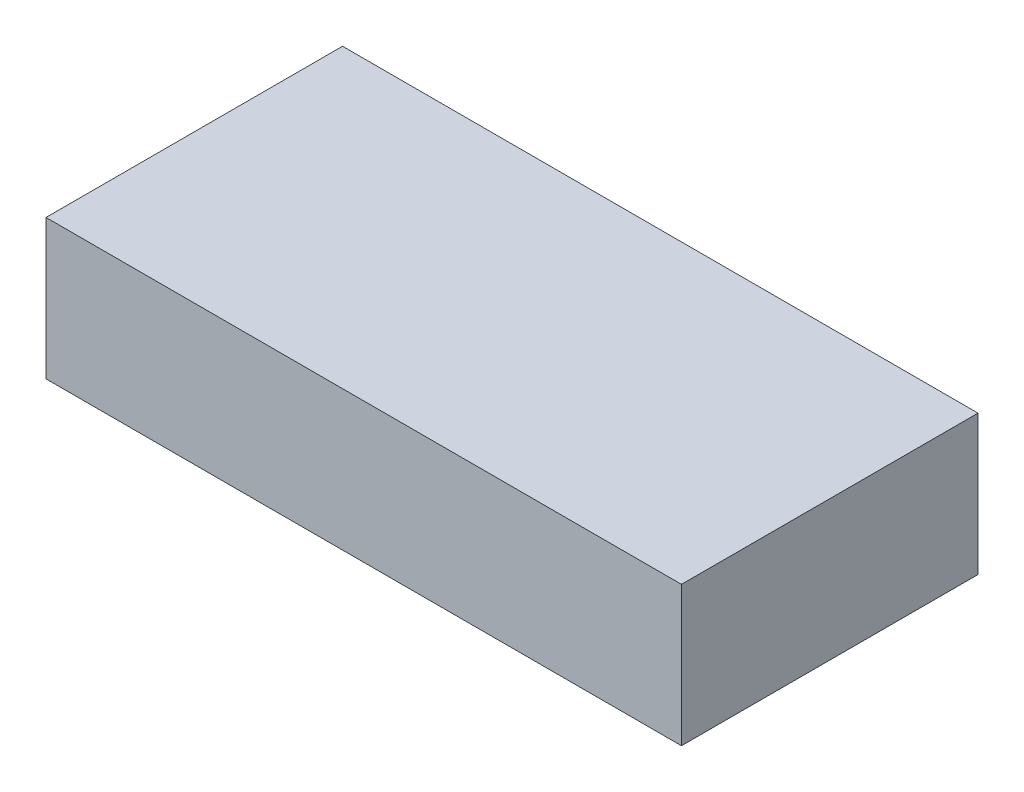
ISO-10303-21;
HEADER;
FILE_DESCRIPTION(('STEP AP214'),'2;1');
FILE_NAME('part.step','',(''),(''),'','','');
FILE_SCHEMA(('AUTOMOTIVE_DESIGN { 1 0 10303 214 1 1 1 1 }'));
ENDSEC;
DATA;
#1=APPLICATION_CONTEXT('core data for automotive mechanical design processes');
#2=APPLICATION_PROTOCOL_DEFINITION('international standard','automotive_design',2000,#1);
#3=PRODUCT_CONTEXT('',#1,'mechanical');
#4=PRODUCT('Part','Part','',(#3));
#5=PRODUCT_RELATED_PRODUCT_CATEGORY('part','',(#4));
#6=PRODUCT_DEFINITION_FORMATION('','',#4);
#7=PRODUCT_DEFINITION_CONTEXT('part definition',#1,'design');
#8=PRODUCT_DEFINITION('design','',#6,#7);
#9=PRODUCT_DEFINITION_SHAPE('','',#8);
#10=(LENGTH_UNIT() NAMED_UNIT(*) SI_UNIT(.MILLI.,.METRE.));
#11=(NAMED_UNIT(*) PLANE_ANGLE_UNIT() SI_UNIT($,.RADIAN.));
#12=(NAMED_UNIT(*) SI_UNIT($,.STERADIAN.) SOLID_ANGLE_UNIT());
#13=UNCERTAINTY_MEASURE_WITH_UNIT(LENGTH_MEASURE(1.E-05),#10,'distance_accuracy_value','');
#14=(GEOMETRIC_REPRESENTATION_CONTEXT(3) GLOBAL_UNCERTAINTY_ASSIGNED_CONTEXT((#13)) GLOBAL_UNIT_ASSIGNED_CONTEXT((#10,
#11,#12)) REPRESENTATION_CONTEXT('',''));
#15=CARTESIAN_POINT('',(0.,0.,0.));
#16=DIRECTION('',(0.,0.,1.));
#17=DIRECTION('',(1.,0.,0.));
#18=AXIS2_PLACEMENT_3D('',#15,#16,#17);
#19=CARTESIAN_POINT('',(-19.05,8.382,8.89));
#20=DIRECTION('',(1.,0.,0.));
#21=DIRECTION('',(0.,0.,-1.));
#22=AXIS2_PLACEMENT_3D('',#19,#20,#21);
#23=PLANE('',#22);
#24=DIRECTION('',(0.,0.,1.));
#25=VECTOR('',#24,1.);
#26=CARTESIAN_POINT('',(-19.05,0.,8.89));
#27=LINE('',#26,#25);
#28=CARTESIAN_POINT('',(-19.05,0.,-8.88999999999999));
#29=VERTEX_POINT('',#28);
#30=CARTESIAN_POINT('',(-19.05,0.,8.89));
#31=VERTEX_POINT('',#30);
#32=EDGE_CURVE('E96',#29,#31,#27,.T.);
#33=ORIENTED_EDGE('',*,*,#32,.T.);
#34=DIRECTION('',(0.,-1.,0.));
#35=VECTOR('',#34,1.);
#36=CARTESIAN_POINT('',(-19.05,8.382,8.89));
#37=LINE('',#36,#35);
#38=CARTESIAN_POINT('',(-19.05,8.382,8.89));
#39=VERTEX_POINT('',#38);
#40=EDGE_CURVE('E11',#39,#31,#37,.T.);
#41=ORIENTED_EDGE('',*,*,#40,.F.);
#42=DIRECTION('',(0.,0.,1.));
#43=VECTOR('',#42,1.);
#44=CARTESIAN_POINT('',(-19.05,8.382,8.89));
#45=LINE('',#44,#43);
#46=CARTESIAN_POINT('',(-19.05,8.382,-8.88999999999999));
#47=VERTEX_POINT('',#46);
#48=EDGE_CURVE('E84',#47,#39,#45,.T.);
#49=ORIENTED_EDGE('',*,*,#48,.F.);
#50=DIRECTION('',(0.,-1.,0.));
#51=VECTOR('',#50,1.);
#52=CARTESIAN_POINT('',(-19.05,8.382,-8.88999999999999));
#53=LINE('',#52,#51);
#54=EDGE_CURVE('E92',#47,#29,#53,.T.);
#55=ORIENTED_EDGE('',*,*,#54,.T.);
#56=EDGE_LOOP('',(#33,#41,#49,#55));
#57=FACE_BOUND('',#56,.T.);
#58=ADVANCED_FACE('F33',(#57),#23,.F.);
#59=CARTESIAN_POINT('',(19.05,8.382,8.88999999999999));
#60=DIRECTION('',(0.,0.,-1.));
#61=DIRECTION('',(-1.,0.,0.));
#62=AXIS2_PLACEMENT_3D('',#59,#60,#61);
#63=PLANE('',#62);
#64=DIRECTION('',(1.,0.,0.));
#65=VECTOR('',#64,1.);
#66=CARTESIAN_POINT('',(19.05,0.,8.88999999999999));
#67=LINE('',#66,#65);
#68=CARTESIAN_POINT('',(19.05,0.,8.88999999999999));
#69=VERTEX_POINT('',#68);
#70=EDGE_CURVE('E88',#31,#69,#67,.T.);
#71=ORIENTED_EDGE('',*,*,#70,.T.);
#72=DIRECTION('',(0.,-1.,0.));
#73=VECTOR('',#72,1.);
#74=CARTESIAN_POINT('',(19.05,8.382,8.88999999999999));
#75=LINE('',#74,#73);
#76=CARTESIAN_POINT('',(19.05,8.382,8.88999999999999));
#77=VERTEX_POINT('',#76);
#78=EDGE_CURVE('E41',#77,#69,#75,.T.);
#79=ORIENTED_EDGE('',*,*,#78,.F.);
#80=DIRECTION('',(1.,0.,0.));
#81=VECTOR('',#80,1.);
#82=CARTESIAN_POINT('',(19.05,8.382,8.88999999999999));
#83=LINE('',#82,#81);
#84=EDGE_CURVE('E79',#39,#77,#83,.T.);
#85=ORIENTED_EDGE('',*,*,#84,.F.);
#86=ORIENTED_EDGE('',*,*,#40,.T.);
#87=EDGE_LOOP('',(#71,#79,#85,#86));
#88=FACE_BOUND('',#87,.T.);
#89=ADVANCED_FACE('F87',(#88),#63,.F.);
#90=CARTESIAN_POINT('',(19.05,8.382,8.88999999999999));
#91=DIRECTION('',(-1.,0.,0.));
#92=DIRECTION('',(0.,0.,1.));
#93=AXIS2_PLACEMENT_3D('',#90,#91,#92);
#94=PLANE('',#93);
#95=DIRECTION('',(0.,0.,-1.));
#96=VECTOR('',#95,1.);
#97=CARTESIAN_POINT('',(19.05,0.,8.88999999999999));
#98=LINE('',#97,#96);
#99=CARTESIAN_POINT('',(19.05,0.,-8.89));
#100=VERTEX_POINT('',#99);
#101=EDGE_CURVE('E66',#69,#100,#98,.T.);
#102=ORIENTED_EDGE('',*,*,#101,.T.);
#103=DIRECTION('',(0.,-1.,0.));
#104=VECTOR('',#103,1.);
#105=CARTESIAN_POINT('',(19.05,8.382,-8.89));
#106=LINE('',#105,#104);
#107=CARTESIAN_POINT('',(19.05,8.382,-8.89));
#108=VERTEX_POINT('',#107);
#109=EDGE_CURVE('E89',#108,#100,#106,.T.);
#110=ORIENTED_EDGE('',*,*,#109,.F.);
#111=DIRECTION('',(0.,0.,-1.));
#112=VECTOR('',#111,1.);
#113=CARTESIAN_POINT('',(19.05,8.382,8.88999999999999));
#114=LINE('',#113,#112);
#115=EDGE_CURVE('E82',#77,#108,#114,.T.);
#116=ORIENTED_EDGE('',*,*,#115,.F.);
#117=ORIENTED_EDGE('',*,*,#78,.T.);
#118=EDGE_LOOP('',(#102,#110,#116,#117));
#119=FACE_BOUND('',#118,.T.);
#120=ADVANCED_FACE('F90',(#119),#94,.F.);
#121=CARTESIAN_POINT('',(19.05,8.382,-8.89));
#122=DIRECTION('',(0.,0.,1.));
#123=DIRECTION('',(1.,0.,0.));
#124=AXIS2_PLACEMENT_3D('',#121,#122,#123);
#125=PLANE('',#124);
#126=DIRECTION('',(-1.,0.,0.));
#127=VECTOR('',#126,1.);
#128=CARTESIAN_POINT('',(19.05,0.,-8.89));
#129=LINE('',#128,#127);
#130=EDGE_CURVE('E72',#100,#29,#129,.T.);
#131=ORIENTED_EDGE('',*,*,#130,.T.);
#132=ORIENTED_EDGE('',*,*,#54,.F.);
#133=DIRECTION('',(-1.,0.,0.));
#134=VECTOR('',#133,1.);
#135=CARTESIAN_POINT('',(19.05,8.382,-8.89));
#136=LINE('',#135,#134);
#137=EDGE_CURVE('E49',#108,#47,#136,.T.);
#138=ORIENTED_EDGE('',*,*,#137,.F.);
#139=ORIENTED_EDGE('',*,*,#109,.T.);
#140=EDGE_LOOP('',(#131,#132,#138,#139));
#141=FACE_BOUND('',#140,.T.);
#142=ADVANCED_FACE('F103',(#141),#125,.F.);
#143=CARTESIAN_POINT('',(0.,8.382,0.));
#144=DIRECTION('',(0.,1.,0.));
#145=DIRECTION('',(0.,0.,1.));
#146=AXIS2_PLACEMENT_3D('',#143,#144,#145);
#147=PLANE('',#146);
#148=ORIENTED_EDGE('',*,*,#48,.T.);
#149=ORIENTED_EDGE('',*,*,#84,.T.);
#150=ORIENTED_EDGE('',*,*,#115,.T.);
#151=ORIENTED_EDGE('',*,*,#137,.T.);
#152=EDGE_LOOP('',(#148,#149,#150,#151));
#153=FACE_BOUND('',#152,.T.);
#154=ADVANCED_FACE('F80',(#153),#147,.T.);
#155=CARTESIAN_POINT('',(0.,0.,0.));
#156=DIRECTION('',(0.,1.,0.));
#157=DIRECTION('',(0.,0.,1.));
#158=AXIS2_PLACEMENT_3D('',#155,#156,#157);
#159=PLANE('',#158);
#160=ORIENTED_EDGE('',*,*,#32,.F.);
#161=ORIENTED_EDGE('',*,*,#130,.F.);
#162=ORIENTED_EDGE('',*,*,#101,.F.);
#163=ORIENTED_EDGE('',*,*,#70,.F.);
#164=EDGE_LOOP('',(#160,#161,#162,#163));
#165=FACE_BOUND('',#164,.T.);
#166=ADVANCED_FACE('F106',(#165),#159,.F.);
#167=CLOSED_SHELL('',(#58,#89,#120,#142,#154,#166));
#168=MANIFOLD_SOLID_BREP('B2',#167);
#169=ADVANCED_BREP_SHAPE_REPRESENTATION('',(#18,#168),#14);
#170=SHAPE_DEFINITION_REPRESENTATION(#9,#169);
ENDSEC;
END-ISO-10303-21;
